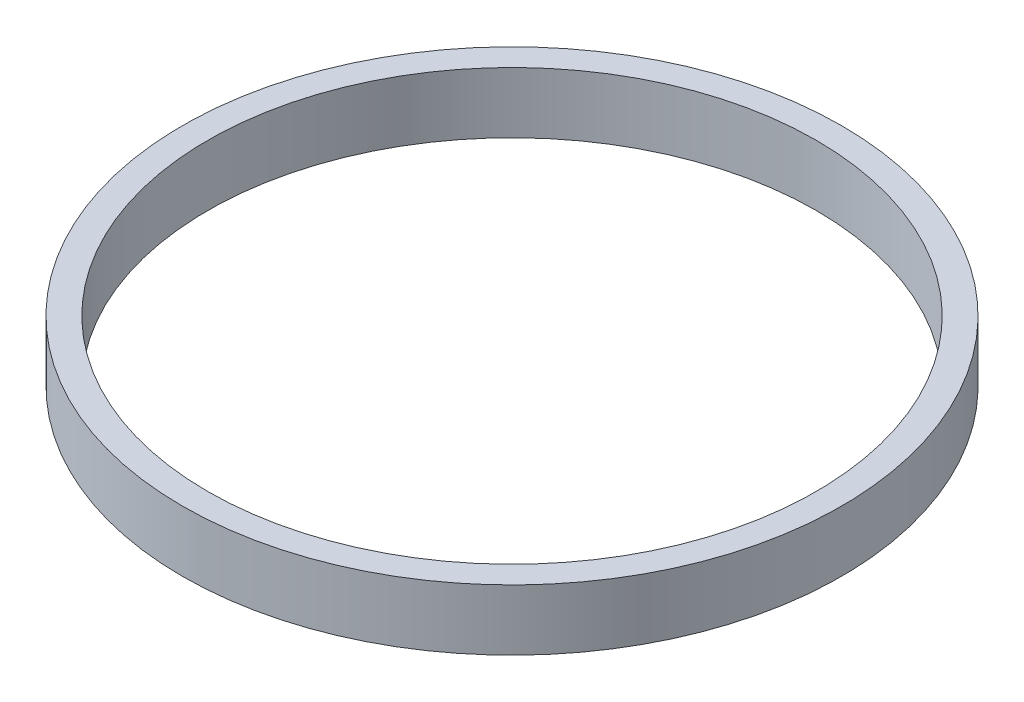
ISO-10303-21;
HEADER;
FILE_DESCRIPTION(('STEP AP214'),'2;1');
FILE_NAME('part.step','',(''),(''),'','','');
FILE_SCHEMA(('AUTOMOTIVE_DESIGN { 1 0 10303 214 1 1 1 1 }'));
ENDSEC;
DATA;
#1=APPLICATION_CONTEXT('core data for automotive mechanical design processes');
#2=APPLICATION_PROTOCOL_DEFINITION('international standard','automotive_design',2000,#1);
#3=PRODUCT_CONTEXT('',#1,'mechanical');
#4=PRODUCT('Part','Part','',(#3));
#5=PRODUCT_RELATED_PRODUCT_CATEGORY('part','',(#4));
#6=PRODUCT_DEFINITION_FORMATION('','',#4);
#7=PRODUCT_DEFINITION_CONTEXT('part definition',#1,'design');
#8=PRODUCT_DEFINITION('design','',#6,#7);
#9=PRODUCT_DEFINITION_SHAPE('','',#8);
#10=(LENGTH_UNIT() NAMED_UNIT(*) SI_UNIT(.MILLI.,.METRE.));
#11=(NAMED_UNIT(*) PLANE_ANGLE_UNIT() SI_UNIT($,.RADIAN.));
#12=(NAMED_UNIT(*) SI_UNIT($,.STERADIAN.) SOLID_ANGLE_UNIT());
#13=UNCERTAINTY_MEASURE_WITH_UNIT(LENGTH_MEASURE(1.E-05),#10,'distance_accuracy_value','');
#14=(GEOMETRIC_REPRESENTATION_CONTEXT(3) GLOBAL_UNCERTAINTY_ASSIGNED_CONTEXT((#13)) GLOBAL_UNIT_ASSIGNED_CONTEXT((#10,
#11,#12)) REPRESENTATION_CONTEXT('',''));
#15=CARTESIAN_POINT('',(0.,0.,0.));
#16=DIRECTION('',(0.,0.,1.));
#17=DIRECTION('',(1.,0.,0.));
#18=AXIS2_PLACEMENT_3D('',#15,#16,#17);
#19=CARTESIAN_POINT('',(0.,3.,0.));
#20=DIRECTION('',(0.,1.,0.));
#21=DIRECTION('',(0.,0.,1.));
#22=AXIS2_PLACEMENT_3D('',#19,#20,#21);
#23=PLANE('',#22);
#24=CARTESIAN_POINT('',(0.,3.,0.));
#25=DIRECTION('',(0.,1.,0.));
#26=DIRECTION('',(0.,0.,1.));
#27=AXIS2_PLACEMENT_3D('',#24,#25,#26);
#28=CIRCLE('',#27,32.5);
#29=CARTESIAN_POINT('',(0.,3.,32.5));
#30=VERTEX_POINT('',#29);
#31=EDGE_CURVE('E10',#30,#30,#28,.T.);
#32=ORIENTED_EDGE('',*,*,#31,.T.);
#33=EDGE_LOOP('',(#32));
#34=FACE_BOUND('',#33,.T.);
#35=CARTESIAN_POINT('',(0.,3.,0.));
#36=DIRECTION('',(0.,1.,0.));
#37=DIRECTION('',(0.,0.,1.));
#38=AXIS2_PLACEMENT_3D('',#35,#36,#37);
#39=CIRCLE('',#38,30.);
#40=CARTESIAN_POINT('',(0.,3.,30.));
#41=VERTEX_POINT('',#40);
#42=EDGE_CURVE('E52',#41,#41,#39,.T.);
#43=ORIENTED_EDGE('',*,*,#42,.F.);
#44=EDGE_LOOP('',(#43));
#45=FACE_BOUND('',#44,.T.);
#46=ADVANCED_FACE('F41',(#34,#45),#23,.T.);
#47=CARTESIAN_POINT('',(0.,-3.,0.));
#48=DIRECTION('',(0.,1.,0.));
#49=DIRECTION('',(0.,0.,1.));
#50=AXIS2_PLACEMENT_3D('',#47,#48,#49);
#51=PLANE('',#50);
#52=CARTESIAN_POINT('',(0.,-3.,0.));
#53=DIRECTION('',(0.,1.,0.));
#54=DIRECTION('',(0.,0.,1.));
#55=AXIS2_PLACEMENT_3D('',#52,#53,#54);
#56=CIRCLE('',#55,32.5);
#57=CARTESIAN_POINT('',(0.,-3.,32.5));
#58=VERTEX_POINT('',#57);
#59=EDGE_CURVE('E45',#58,#58,#56,.T.);
#60=ORIENTED_EDGE('',*,*,#59,.F.);
#61=EDGE_LOOP('',(#60));
#62=FACE_BOUND('',#61,.T.);
#63=CARTESIAN_POINT('',(0.,-3.,0.));
#64=DIRECTION('',(0.,1.,0.));
#65=DIRECTION('',(0.,0.,1.));
#66=AXIS2_PLACEMENT_3D('',#63,#64,#65);
#67=CIRCLE('',#66,30.);
#68=CARTESIAN_POINT('',(0.,-3.,30.));
#69=VERTEX_POINT('',#68);
#70=EDGE_CURVE('E54',#69,#69,#67,.T.);
#71=ORIENTED_EDGE('',*,*,#70,.T.);
#72=EDGE_LOOP('',(#71));
#73=FACE_BOUND('',#72,.T.);
#74=ADVANCED_FACE('F64',(#62,#73),#51,.F.);
#75=CARTESIAN_POINT('',(0.,3.,0.));
#76=DIRECTION('',(0.,-1.,0.));
#77=DIRECTION('',(0.,0.,-1.));
#78=AXIS2_PLACEMENT_3D('',#75,#76,#77);
#79=CYLINDRICAL_SURFACE('',#78,32.5);
#80=ORIENTED_EDGE('',*,*,#31,.F.);
#81=EDGE_LOOP('',(#80));
#82=FACE_BOUND('',#81,.T.);
#83=ORIENTED_EDGE('',*,*,#59,.T.);
#84=EDGE_LOOP('',(#83));
#85=FACE_BOUND('',#84,.T.);
#86=ADVANCED_FACE('F43',(#82,#85),#79,.T.);
#87=CARTESIAN_POINT('',(0.,3.,0.));
#88=DIRECTION('',(0.,-1.,0.));
#89=DIRECTION('',(0.,0.,-1.));
#90=AXIS2_PLACEMENT_3D('',#87,#88,#89);
#91=CYLINDRICAL_SURFACE('',#90,30.);
#92=ORIENTED_EDGE('',*,*,#42,.T.);
#93=EDGE_LOOP('',(#92));
#94=FACE_BOUND('',#93,.T.);
#95=ORIENTED_EDGE('',*,*,#70,.F.);
#96=EDGE_LOOP('',(#95));
#97=FACE_BOUND('',#96,.T.);
#98=ADVANCED_FACE('F60',(#94,#97),#91,.F.);
#99=CLOSED_SHELL('',(#46,#74,#86,#98));
#100=MANIFOLD_SOLID_BREP('B2',#99);
#101=ADVANCED_BREP_SHAPE_REPRESENTATION('',(#18,#100),#14);
#102=SHAPE_DEFINITION_REPRESENTATION(#9,#101);
ENDSEC;
END-ISO-10303-21;
